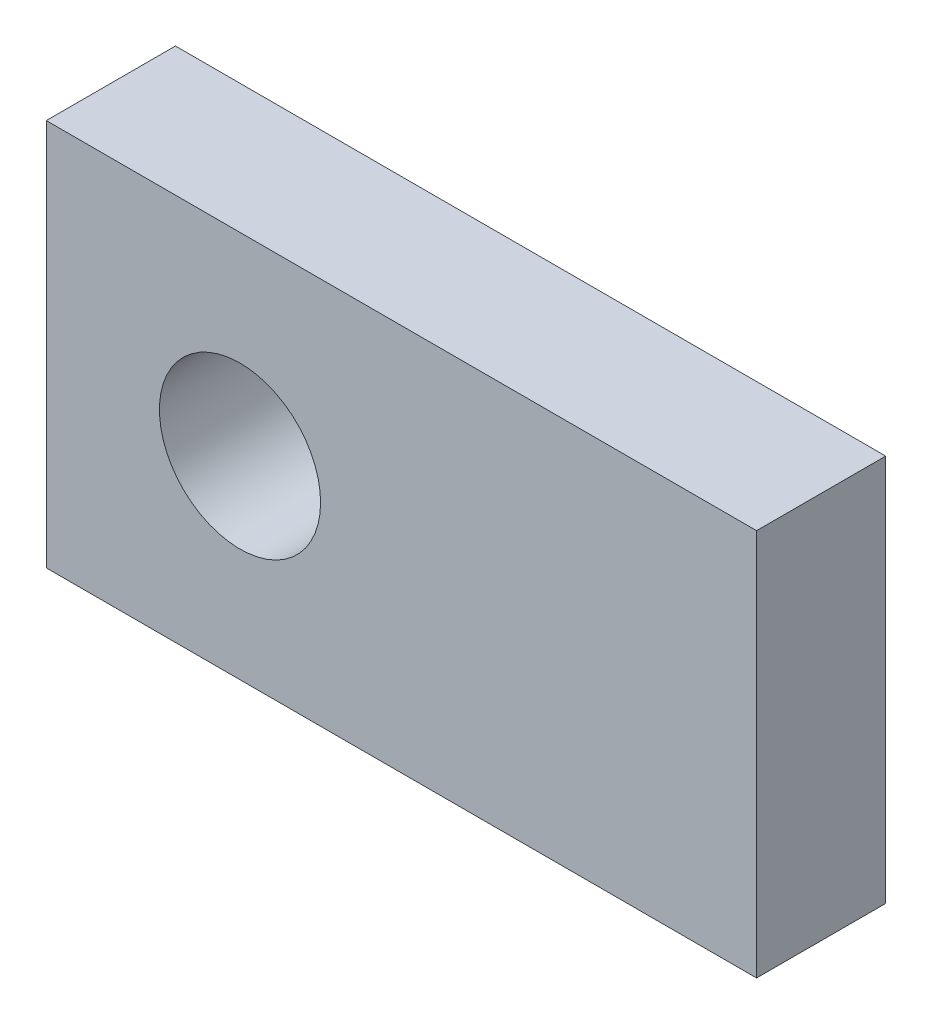
ISO-10303-21;
HEADER;
FILE_DESCRIPTION(('STEP AP214'),'2;1');
FILE_NAME('part.step','',(''),(''),'','','');
FILE_SCHEMA(('AUTOMOTIVE_DESIGN { 1 0 10303 214 1 1 1 1 }'));
ENDSEC;
DATA;
#1=APPLICATION_CONTEXT('core data for automotive mechanical design processes');
#2=APPLICATION_PROTOCOL_DEFINITION('international standard','automotive_design',2000,#1);
#3=PRODUCT_CONTEXT('',#1,'mechanical');
#4=PRODUCT('Part','Part','',(#3));
#5=PRODUCT_RELATED_PRODUCT_CATEGORY('part','',(#4));
#6=PRODUCT_DEFINITION_FORMATION('','',#4);
#7=PRODUCT_DEFINITION_CONTEXT('part definition',#1,'design');
#8=PRODUCT_DEFINITION('design','',#6,#7);
#9=PRODUCT_DEFINITION_SHAPE('','',#8);
#10=(LENGTH_UNIT() NAMED_UNIT(*) SI_UNIT(.MILLI.,.METRE.));
#11=(NAMED_UNIT(*) PLANE_ANGLE_UNIT() SI_UNIT($,.RADIAN.));
#12=(NAMED_UNIT(*) SI_UNIT($,.STERADIAN.) SOLID_ANGLE_UNIT());
#13=UNCERTAINTY_MEASURE_WITH_UNIT(LENGTH_MEASURE(1.E-05),#10,'distance_accuracy_value','');
#14=(GEOMETRIC_REPRESENTATION_CONTEXT(3) GLOBAL_UNCERTAINTY_ASSIGNED_CONTEXT((#13)) GLOBAL_UNIT_ASSIGNED_CONTEXT((#10,
#11,#12)) REPRESENTATION_CONTEXT('',''));
#15=CARTESIAN_POINT('',(0.,0.,0.));
#16=DIRECTION('',(0.,0.,1.));
#17=DIRECTION('',(1.,0.,0.));
#18=AXIS2_PLACEMENT_3D('',#15,#16,#17);
#19=CARTESIAN_POINT('',(0.,0.,6.35));
#20=DIRECTION('',(0.,0.,-1.));
#21=DIRECTION('',(-1.,0.,0.));
#22=AXIS2_PLACEMENT_3D('',#19,#20,#21);
#23=PLANE('',#22);
#24=DIRECTION('',(0.,1.,0.));
#25=VECTOR('',#24,1.);
#26=CARTESIAN_POINT('',(17.4625,-9.525,6.35));
#27=LINE('',#26,#25);
#28=CARTESIAN_POINT('',(17.4625,-9.525,6.35));
#29=VERTEX_POINT('',#28);
#30=CARTESIAN_POINT('',(17.4625,9.525,6.35));
#31=VERTEX_POINT('',#30);
#32=EDGE_CURVE('E92',#29,#31,#27,.T.);
#33=ORIENTED_EDGE('',*,*,#32,.T.);
#34=DIRECTION('',(-1.,0.,0.));
#35=VECTOR('',#34,1.);
#36=CARTESIAN_POINT('',(-17.4625,9.525,6.35));
#37=LINE('',#36,#35);
#38=CARTESIAN_POINT('',(-17.4625,9.525,6.35));
#39=VERTEX_POINT('',#38);
#40=EDGE_CURVE('E87',#31,#39,#37,.T.);
#41=ORIENTED_EDGE('',*,*,#40,.T.);
#42=DIRECTION('',(0.,-1.,0.));
#43=VECTOR('',#42,1.);
#44=CARTESIAN_POINT('',(-17.4625,-9.525,6.35));
#45=LINE('',#44,#43);
#46=CARTESIAN_POINT('',(-17.4625,-9.525,6.35));
#47=VERTEX_POINT('',#46);
#48=EDGE_CURVE('E90',#39,#47,#45,.T.);
#49=ORIENTED_EDGE('',*,*,#48,.T.);
#50=DIRECTION('',(1.,0.,0.));
#51=VECTOR('',#50,1.);
#52=CARTESIAN_POINT('',(-17.4625,-9.525,6.35));
#53=LINE('',#52,#51);
#54=EDGE_CURVE('E57',#47,#29,#53,.T.);
#55=ORIENTED_EDGE('',*,*,#54,.T.);
#56=EDGE_LOOP('',(#33,#41,#49,#55));
#57=FACE_BOUND('',#56,.T.);
#58=CARTESIAN_POINT('',(-7.93749999999998,0.,6.35));
#59=DIRECTION('',(0.,0.,1.));
#60=DIRECTION('',(1.,0.,0.));
#61=AXIS2_PLACEMENT_3D('',#58,#59,#60);
#62=CIRCLE('',#61,3.9624);
#63=CARTESIAN_POINT('',(-3.97509999999998,0.,6.35));
#64=VERTEX_POINT('',#63);
#65=EDGE_CURVE('E112',#64,#64,#62,.T.);
#66=ORIENTED_EDGE('',*,*,#65,.F.);
#67=EDGE_LOOP('',(#66));
#68=FACE_BOUND('',#67,.T.);
#69=ADVANCED_FACE('F39',(#57,#68),#23,.F.);
#70=CARTESIAN_POINT('',(0.,0.,0.));
#71=DIRECTION('',(0.,0.,-1.));
#72=DIRECTION('',(-1.,0.,0.));
#73=AXIS2_PLACEMENT_3D('',#70,#71,#72);
#74=PLANE('',#73);
#75=DIRECTION('',(0.,1.,0.));
#76=VECTOR('',#75,1.);
#77=CARTESIAN_POINT('',(17.4625,-9.525,0.));
#78=LINE('',#77,#76);
#79=CARTESIAN_POINT('',(17.4625,-9.525,0.));
#80=VERTEX_POINT('',#79);
#81=CARTESIAN_POINT('',(17.4625,9.525,0.));
#82=VERTEX_POINT('',#81);
#83=EDGE_CURVE('E108',#80,#82,#78,.T.);
#84=ORIENTED_EDGE('',*,*,#83,.F.);
#85=DIRECTION('',(1.,0.,0.));
#86=VECTOR('',#85,1.);
#87=CARTESIAN_POINT('',(-17.4625,-9.525,0.));
#88=LINE('',#87,#86);
#89=CARTESIAN_POINT('',(-17.4625,-9.525,0.));
#90=VERTEX_POINT('',#89);
#91=EDGE_CURVE('E80',#90,#80,#88,.T.);
#92=ORIENTED_EDGE('',*,*,#91,.F.);
#93=DIRECTION('',(0.,-1.,0.));
#94=VECTOR('',#93,1.);
#95=CARTESIAN_POINT('',(-17.4625,-9.525,0.));
#96=LINE('',#95,#94);
#97=CARTESIAN_POINT('',(-17.4625,9.525,0.));
#98=VERTEX_POINT('',#97);
#99=EDGE_CURVE('E74',#98,#90,#96,.T.);
#100=ORIENTED_EDGE('',*,*,#99,.F.);
#101=DIRECTION('',(-1.,0.,0.));
#102=VECTOR('',#101,1.);
#103=CARTESIAN_POINT('',(-17.4625,9.525,0.));
#104=LINE('',#103,#102);
#105=EDGE_CURVE('E97',#82,#98,#104,.T.);
#106=ORIENTED_EDGE('',*,*,#105,.F.);
#107=EDGE_LOOP('',(#84,#92,#100,#106));
#108=FACE_BOUND('',#107,.T.);
#109=CARTESIAN_POINT('',(-7.93749999999998,0.,0.));
#110=DIRECTION('',(0.,0.,1.));
#111=DIRECTION('',(1.,0.,0.));
#112=AXIS2_PLACEMENT_3D('',#109,#110,#111);
#113=CIRCLE('',#112,3.9624);
#114=CARTESIAN_POINT('',(-3.97509999999998,0.,0.));
#115=VERTEX_POINT('',#114);
#116=EDGE_CURVE('E130',#115,#115,#113,.T.);
#117=ORIENTED_EDGE('',*,*,#116,.T.);
#118=EDGE_LOOP('',(#117));
#119=FACE_BOUND('',#118,.T.);
#120=ADVANCED_FACE('F125',(#108,#119),#74,.T.);
#121=CARTESIAN_POINT('',(17.4625,-9.525,6.35));
#122=DIRECTION('',(-1.,0.,0.));
#123=DIRECTION('',(0.,0.,1.));
#124=AXIS2_PLACEMENT_3D('',#121,#122,#123);
#125=PLANE('',#124);
#126=ORIENTED_EDGE('',*,*,#83,.T.);
#127=DIRECTION('',(0.,0.,-1.));
#128=VECTOR('',#127,1.);
#129=CARTESIAN_POINT('',(17.4625,9.525,6.35));
#130=LINE('',#129,#128);
#131=EDGE_CURVE('E11',#31,#82,#130,.T.);
#132=ORIENTED_EDGE('',*,*,#131,.F.);
#133=ORIENTED_EDGE('',*,*,#32,.F.);
#134=DIRECTION('',(0.,0.,-1.));
#135=VECTOR('',#134,1.);
#136=CARTESIAN_POINT('',(17.4625,-9.525,6.35));
#137=LINE('',#136,#135);
#138=EDGE_CURVE('E104',#29,#80,#137,.T.);
#139=ORIENTED_EDGE('',*,*,#138,.T.);
#140=EDGE_LOOP('',(#126,#132,#133,#139));
#141=FACE_BOUND('',#140,.T.);
#142=ADVANCED_FACE('F41',(#141),#125,.F.);
#143=CARTESIAN_POINT('',(-17.4625,9.525,6.35));
#144=DIRECTION('',(0.,-1.,0.));
#145=DIRECTION('',(0.,0.,-1.));
#146=AXIS2_PLACEMENT_3D('',#143,#144,#145);
#147=PLANE('',#146);
#148=ORIENTED_EDGE('',*,*,#105,.T.);
#149=DIRECTION('',(0.,0.,-1.));
#150=VECTOR('',#149,1.);
#151=CARTESIAN_POINT('',(-17.4625,9.525,6.35));
#152=LINE('',#151,#150);
#153=EDGE_CURVE('E49',#39,#98,#152,.T.);
#154=ORIENTED_EDGE('',*,*,#153,.F.);
#155=ORIENTED_EDGE('',*,*,#40,.F.);
#156=ORIENTED_EDGE('',*,*,#131,.T.);
#157=EDGE_LOOP('',(#148,#154,#155,#156));
#158=FACE_BOUND('',#157,.T.);
#159=ADVANCED_FACE('F96',(#158),#147,.F.);
#160=CARTESIAN_POINT('',(-17.4625,-9.525,6.35));
#161=DIRECTION('',(1.,0.,0.));
#162=DIRECTION('',(0.,0.,-1.));
#163=AXIS2_PLACEMENT_3D('',#160,#161,#162);
#164=PLANE('',#163);
#165=ORIENTED_EDGE('',*,*,#99,.T.);
#166=DIRECTION('',(0.,0.,-1.));
#167=VECTOR('',#166,1.);
#168=CARTESIAN_POINT('',(-17.4625,-9.525,6.35));
#169=LINE('',#168,#167);
#170=EDGE_CURVE('E99',#47,#90,#169,.T.);
#171=ORIENTED_EDGE('',*,*,#170,.F.);
#172=ORIENTED_EDGE('',*,*,#48,.F.);
#173=ORIENTED_EDGE('',*,*,#153,.T.);
#174=EDGE_LOOP('',(#165,#171,#172,#173));
#175=FACE_BOUND('',#174,.T.);
#176=ADVANCED_FACE('F100',(#175),#164,.F.);
#177=CARTESIAN_POINT('',(-17.4625,-9.525,6.35));
#178=DIRECTION('',(0.,1.,0.));
#179=DIRECTION('',(0.,0.,1.));
#180=AXIS2_PLACEMENT_3D('',#177,#178,#179);
#181=PLANE('',#180);
#182=ORIENTED_EDGE('',*,*,#91,.T.);
#183=ORIENTED_EDGE('',*,*,#138,.F.);
#184=ORIENTED_EDGE('',*,*,#54,.F.);
#185=ORIENTED_EDGE('',*,*,#170,.T.);
#186=EDGE_LOOP('',(#182,#183,#184,#185));
#187=FACE_BOUND('',#186,.T.);
#188=ADVANCED_FACE('F122',(#187),#181,.F.);
#189=CARTESIAN_POINT('',(-7.93749999999998,0.,6.35));
#190=DIRECTION('',(0.,0.,-1.));
#191=DIRECTION('',(-1.,0.,0.));
#192=AXIS2_PLACEMENT_3D('',#189,#190,#191);
#193=CYLINDRICAL_SURFACE('',#192,3.9624);
#194=ORIENTED_EDGE('',*,*,#65,.T.);
#195=EDGE_LOOP('',(#194));
#196=FACE_BOUND('',#195,.T.);
#197=ORIENTED_EDGE('',*,*,#116,.F.);
#198=EDGE_LOOP('',(#197));
#199=FACE_BOUND('',#198,.T.);
#200=ADVANCED_FACE('F138',(#196,#199),#193,.F.);
#201=CLOSED_SHELL('',(#69,#120,#142,#159,#176,#188,#200));
#202=MANIFOLD_SOLID_BREP('B2',#201);
#203=ADVANCED_BREP_SHAPE_REPRESENTATION('',(#18,#202),#14);
#204=SHAPE_DEFINITION_REPRESENTATION(#9,#203);
ENDSEC;
END-ISO-10303-21;
